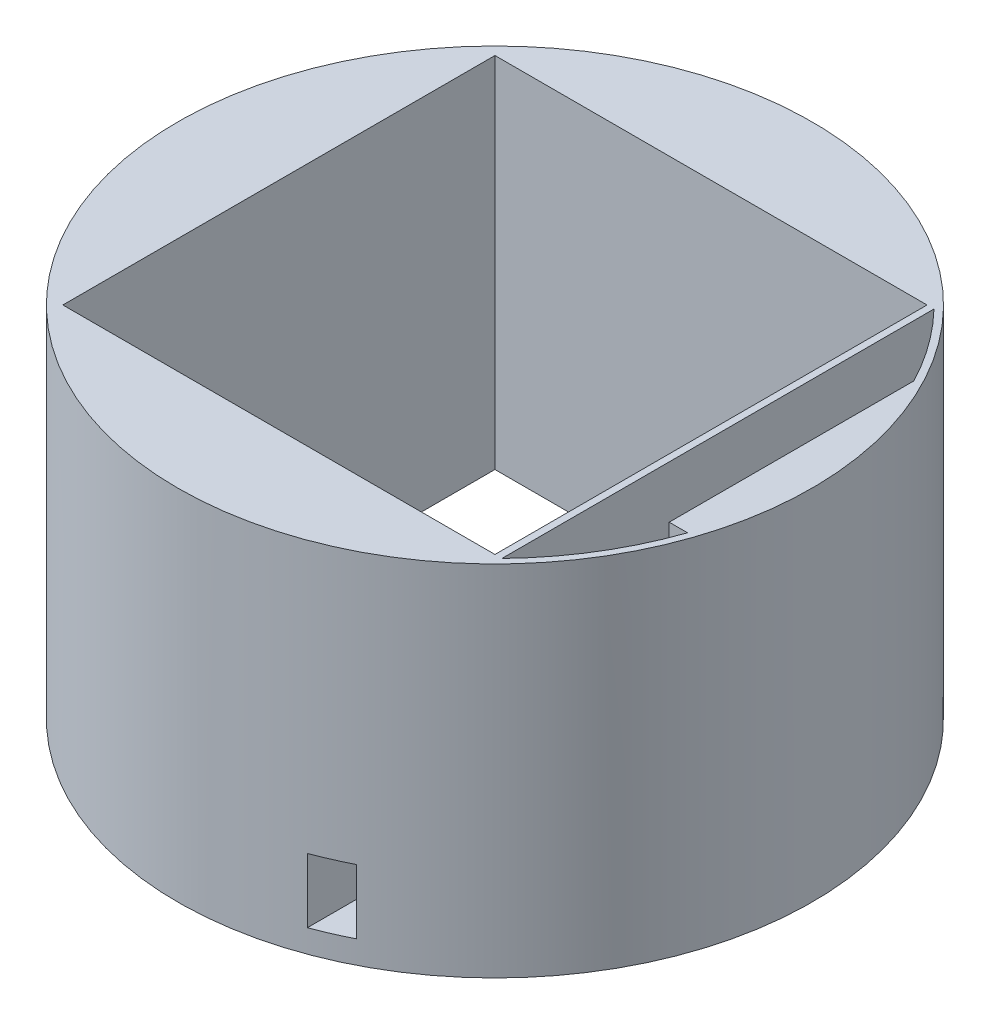
ISO-10303-21;
HEADER;
FILE_DESCRIPTION(('STEP AP214'),'2;1');
FILE_NAME('part.step','',(''),(''),'','','');
FILE_SCHEMA(('AUTOMOTIVE_DESIGN { 1 0 10303 214 1 1 1 1 }'));
ENDSEC;
DATA;
#1=APPLICATION_CONTEXT('core data for automotive mechanical design processes');
#2=APPLICATION_PROTOCOL_DEFINITION('international standard','automotive_design',2000,#1);
#3=PRODUCT_CONTEXT('',#1,'mechanical');
#4=PRODUCT('Part','Part','',(#3));
#5=PRODUCT_RELATED_PRODUCT_CATEGORY('part','',(#4));
#6=PRODUCT_DEFINITION_FORMATION('','',#4);
#7=PRODUCT_DEFINITION_CONTEXT('part definition',#1,'design');
#8=PRODUCT_DEFINITION('design','',#6,#7);
#9=PRODUCT_DEFINITION_SHAPE('','',#8);
#10=(LENGTH_UNIT() NAMED_UNIT(*) SI_UNIT(.MILLI.,.METRE.));
#11=(NAMED_UNIT(*) PLANE_ANGLE_UNIT() SI_UNIT($,.RADIAN.));
#12=(NAMED_UNIT(*) SI_UNIT($,.STERADIAN.) SOLID_ANGLE_UNIT());
#13=UNCERTAINTY_MEASURE_WITH_UNIT(LENGTH_MEASURE(1.E-05),#10,'distance_accuracy_value','');
#14=(GEOMETRIC_REPRESENTATION_CONTEXT(3) GLOBAL_UNCERTAINTY_ASSIGNED_CONTEXT((#13)) GLOBAL_UNIT_ASSIGNED_CONTEXT((#10,
#11,#12)) REPRESENTATION_CONTEXT('',''));
#15=CARTESIAN_POINT('',(0.,0.,0.));
#16=DIRECTION('',(0.,0.,1.));
#17=DIRECTION('',(1.,0.,0.));
#18=AXIS2_PLACEMENT_3D('',#15,#16,#17);
#19=CARTESIAN_POINT('',(0.,2.5,0.));
#20=DIRECTION('',(0.,-1.,0.));
#21=DIRECTION('',(0.,0.,-1.));
#22=AXIS2_PLACEMENT_3D('',#19,#20,#21);
#23=CYLINDRICAL_SURFACE('',#22,33.7713769837538);
#24=CARTESIAN_POINT('',(0.,0.,0.));
#25=DIRECTION('',(0.,1.,0.));
#26=DIRECTION('',(0.,0.,1.));
#27=AXIS2_PLACEMENT_3D('',#24,#25,#26);
#28=CIRCLE('',#27,33.7713769837538);
#29=CARTESIAN_POINT('',(24.2539873707153,0.,23.5));
#30=VERTEX_POINT('',#29);
#31=CARTESIAN_POINT('',(31.9353808803689,0.,10.9835036033403));
#32=VERTEX_POINT('',#31);
#33=EDGE_CURVE('E356',#30,#32,#28,.T.);
#34=ORIENTED_EDGE('',*,*,#33,.F.);
#35=DIRECTION('',(0.,-1.,0.));
#36=VECTOR('',#35,1.);
#37=CARTESIAN_POINT('',(24.2539873707153,2.5,23.5));
#38=LINE('',#37,#36);
#39=CARTESIAN_POINT('',(24.2539873707153,7.,23.5));
#40=VERTEX_POINT('',#39);
#41=EDGE_CURVE('E80',#40,#30,#38,.T.);
#42=ORIENTED_EDGE('',*,*,#41,.F.);
#43=DIRECTION('',(0.,-1.,0.));
#44=VECTOR('',#43,1.);
#45=CARTESIAN_POINT('',(24.2539873707153,9.5,23.5));
#46=LINE('',#45,#44);
#47=CARTESIAN_POINT('',(24.2539873707153,39.,23.5));
#48=VERTEX_POINT('',#47);
#49=EDGE_CURVE('E308',#48,#40,#46,.T.);
#50=ORIENTED_EDGE('',*,*,#49,.F.);
#51=CARTESIAN_POINT('',(0.,39.,0.));
#52=DIRECTION('',(0.,1.,0.));
#53=DIRECTION('',(0.,0.,1.));
#54=AXIS2_PLACEMENT_3D('',#51,#52,#53);
#55=CIRCLE('',#54,33.7713769837538);
#56=CARTESIAN_POINT('',(31.9353808803689,39.,10.9835036033403));
#57=VERTEX_POINT('',#56);
#58=EDGE_CURVE('E237',#57,#48,#55,.F.);
#59=ORIENTED_EDGE('',*,*,#58,.F.);
#60=DIRECTION('',(0.,-1.,0.));
#61=VECTOR('',#60,1.);
#62=CARTESIAN_POINT('',(31.9353808803689,2.5,10.9835036033403));
#63=LINE('',#62,#61);
#64=EDGE_CURVE('E364',#57,#32,#63,.T.);
#65=ORIENTED_EDGE('',*,*,#64,.T.);
#66=EDGE_LOOP('',(#34,#42,#50,#59,#65));
#67=FACE_BOUND('',#66,.T.);
#68=ADVANCED_FACE('F77',(#67),#23,.F.);
#69=CARTESIAN_POINT('',(0.,2.5,23.5));
#70=DIRECTION('',(0.,0.,-1.));
#71=DIRECTION('',(-1.,0.,0.));
#72=AXIS2_PLACEMENT_3D('',#69,#70,#71);
#73=PLANE('',#72);
#74=DIRECTION('',(0.,-1.,0.));
#75=VECTOR('',#74,1.);
#76=CARTESIAN_POINT('',(15.6883602187177,7.,23.5));
#77=LINE('',#76,#75);
#78=CARTESIAN_POINT('',(15.6883602187177,9.5,23.5));
#79=VERTEX_POINT('',#78);
#80=CARTESIAN_POINT('',(15.6883602187177,2.5,23.5));
#81=VERTEX_POINT('',#80);
#82=EDGE_CURVE('E352',#79,#81,#77,.T.);
#83=ORIENTED_EDGE('',*,*,#82,.F.);
#84=DIRECTION('',(-1.,0.,0.));
#85=VECTOR('',#84,1.);
#86=CARTESIAN_POINT('',(0.,9.5,23.5));
#87=LINE('',#86,#85);
#88=CARTESIAN_POINT('',(11.9573026246151,9.5,23.5));
#89=VERTEX_POINT('',#88);
#90=EDGE_CURVE('E270',#79,#89,#87,.T.);
#91=ORIENTED_EDGE('',*,*,#90,.T.);
#92=DIRECTION('',(0.,-1.,0.));
#93=VECTOR('',#92,1.);
#94=CARTESIAN_POINT('',(11.9573026246151,7.,23.5));
#95=LINE('',#94,#93);
#96=CARTESIAN_POINT('',(11.9573026246151,2.5,23.5));
#97=VERTEX_POINT('',#96);
#98=EDGE_CURVE('E331',#89,#97,#95,.T.);
#99=ORIENTED_EDGE('',*,*,#98,.T.);
#100=DIRECTION('',(1.,0.,0.));
#101=VECTOR('',#100,1.);
#102=CARTESIAN_POINT('',(0.,2.5,23.5));
#103=LINE('',#102,#101);
#104=EDGE_CURVE('E357',#97,#81,#103,.T.);
#105=ORIENTED_EDGE('',*,*,#104,.T.);
#106=EDGE_LOOP('',(#83,#91,#99,#105));
#107=FACE_BOUND('',#106,.T.);
#108=DIRECTION('',(1.,0.,0.));
#109=VECTOR('',#108,1.);
#110=CARTESIAN_POINT('',(0.,0.,23.5));
#111=LINE('',#110,#109);
#112=CARTESIAN_POINT('',(-25.2586618806302,0.,23.5));
#113=VERTEX_POINT('',#112);
#114=EDGE_CURVE('E368',#113,#30,#111,.T.);
#115=ORIENTED_EDGE('',*,*,#114,.F.);
#116=DIRECTION('',(0.,-1.,0.));
#117=VECTOR('',#116,1.);
#118=CARTESIAN_POINT('',(-25.2586618806302,2.5,23.5));
#119=LINE('',#118,#117);
#120=CARTESIAN_POINT('',(-25.2586618806302,7.,23.5));
#121=VERTEX_POINT('',#120);
#122=EDGE_CURVE('E411',#121,#113,#119,.T.);
#123=ORIENTED_EDGE('',*,*,#122,.F.);
#124=DIRECTION('',(-1.,0.,0.));
#125=VECTOR('',#124,1.);
#126=CARTESIAN_POINT('',(0.,7.,23.5));
#127=LINE('',#126,#125);
#128=CARTESIAN_POINT('',(-23.5,7.,23.5));
#129=VERTEX_POINT('',#128);
#130=EDGE_CURVE('E320',#129,#121,#127,.T.);
#131=ORIENTED_EDGE('',*,*,#130,.F.);
#132=DIRECTION('',(0.,-1.,0.));
#133=VECTOR('',#132,1.);
#134=CARTESIAN_POINT('',(-23.5,9.5,23.5));
#135=LINE('',#134,#133);
#136=CARTESIAN_POINT('',(-23.5,39.,23.5));
#137=VERTEX_POINT('',#136);
#138=EDGE_CURVE('E291',#137,#129,#135,.T.);
#139=ORIENTED_EDGE('',*,*,#138,.F.);
#140=DIRECTION('',(-1.,0.,0.));
#141=VECTOR('',#140,1.);
#142=CARTESIAN_POINT('',(0.,39.,23.5));
#143=LINE('',#142,#141);
#144=CARTESIAN_POINT('',(23.5,39.,23.5));
#145=VERTEX_POINT('',#144);
#146=EDGE_CURVE('E253',#145,#137,#143,.T.);
#147=ORIENTED_EDGE('',*,*,#146,.F.);
#148=DIRECTION('',(0.,-1.,0.));
#149=VECTOR('',#148,1.);
#150=CARTESIAN_POINT('',(23.5,9.5,23.5));
#151=LINE('',#150,#149);
#152=CARTESIAN_POINT('',(23.5,7.,23.5));
#153=VERTEX_POINT('',#152);
#154=EDGE_CURVE('E309',#145,#153,#151,.T.);
#155=ORIENTED_EDGE('',*,*,#154,.T.);
#156=DIRECTION('',(-1.,0.,0.));
#157=VECTOR('',#156,1.);
#158=CARTESIAN_POINT('',(0.,7.,23.5));
#159=LINE('',#158,#157);
#160=EDGE_CURVE('E336',#40,#153,#159,.T.);
#161=ORIENTED_EDGE('',*,*,#160,.F.);
#162=ORIENTED_EDGE('',*,*,#41,.T.);
#163=EDGE_LOOP('',(#115,#123,#131,#139,#147,#155,#161,#162));
#164=FACE_BOUND('',#163,.T.);
#165=ADVANCED_FACE('F420',(#107,#164),#73,.T.);
#166=CARTESIAN_POINT('',(0.,2.5,0.));
#167=DIRECTION('',(0.,-1.,0.));
#168=DIRECTION('',(0.,0.,-1.));
#169=AXIS2_PLACEMENT_3D('',#166,#167,#168);
#170=CYLINDRICAL_SURFACE('',#169,34.5);
#171=DIRECTION('',(0.,-1.,0.));
#172=VECTOR('',#171,1.);
#173=CARTESIAN_POINT('',(-32.7049330926607,2.5,10.9835036033403));
#174=LINE('',#173,#172);
#175=CARTESIAN_POINT('',(-32.7049330926607,7.,10.9835036033403));
#176=VERTEX_POINT('',#175);
#177=CARTESIAN_POINT('',(-32.7049330926607,0.,10.9835036033403));
#178=VERTEX_POINT('',#177);
#179=EDGE_CURVE('E409',#176,#178,#174,.T.);
#180=ORIENTED_EDGE('',*,*,#179,.F.);
#181=CARTESIAN_POINT('',(0.,7.,0.));
#182=DIRECTION('',(0.,1.,0.));
#183=DIRECTION('',(0.,0.,1.));
#184=AXIS2_PLACEMENT_3D('',#181,#182,#183);
#185=CIRCLE('',#184,34.5);
#186=EDGE_CURVE('E295',#176,#121,#185,.T.);
#187=ORIENTED_EDGE('',*,*,#186,.T.);
#188=ORIENTED_EDGE('',*,*,#122,.T.);
#189=CARTESIAN_POINT('',(0.,0.,0.));
#190=DIRECTION('',(0.,1.,0.));
#191=DIRECTION('',(0.,0.,1.));
#192=AXIS2_PLACEMENT_3D('',#189,#190,#191);
#193=CIRCLE('',#192,34.5);
#194=EDGE_CURVE('E372',#113,#178,#193,.T.);
#195=ORIENTED_EDGE('',*,*,#194,.T.);
#196=EDGE_LOOP('',(#180,#187,#188,#195));
#197=FACE_BOUND('',#196,.T.);
#198=DIRECTION('',(0.,-1.,0.));
#199=VECTOR('',#198,1.);
#200=CARTESIAN_POINT('',(11.9573026246151,7.,32.3615962823742));
#201=LINE('',#200,#199);
#202=CARTESIAN_POINT('',(11.9573026246151,9.5,32.3615962823742));
#203=VERTEX_POINT('',#202);
#204=CARTESIAN_POINT('',(11.9573026246151,2.5,32.3615962823742));
#205=VERTEX_POINT('',#204);
#206=EDGE_CURVE('E324',#203,#205,#201,.T.);
#207=ORIENTED_EDGE('',*,*,#206,.F.);
#208=CARTESIAN_POINT('',(0.,9.5,0.));
#209=DIRECTION('',(0.,1.,0.));
#210=DIRECTION('',(0.,0.,1.));
#211=AXIS2_PLACEMENT_3D('',#208,#209,#210);
#212=CIRCLE('',#211,34.5);
#213=CARTESIAN_POINT('',(15.6883602187177,9.5,30.7266228806186));
#214=VERTEX_POINT('',#213);
#215=EDGE_CURVE('E262',#203,#214,#212,.T.);
#216=ORIENTED_EDGE('',*,*,#215,.T.);
#217=DIRECTION('',(0.,-1.,0.));
#218=VECTOR('',#217,1.);
#219=CARTESIAN_POINT('',(15.6883602187177,7.,30.7266228806186));
#220=LINE('',#219,#218);
#221=CARTESIAN_POINT('',(15.6883602187177,2.5,30.7266228806186));
#222=VERTEX_POINT('',#221);
#223=EDGE_CURVE('E345',#214,#222,#220,.T.);
#224=ORIENTED_EDGE('',*,*,#223,.T.);
#225=CARTESIAN_POINT('',(0.,2.5,0.));
#226=DIRECTION('',(0.,1.,0.));
#227=DIRECTION('',(0.,0.,1.));
#228=AXIS2_PLACEMENT_3D('',#225,#226,#227);
#229=CIRCLE('',#228,34.5);
#230=EDGE_CURVE('E360',#205,#222,#229,.T.);
#231=ORIENTED_EDGE('',*,*,#230,.F.);
#232=EDGE_LOOP('',(#207,#216,#224,#231));
#233=FACE_BOUND('',#232,.T.);
#234=CARTESIAN_POINT('',(0.,39.,0.));
#235=DIRECTION('',(0.,1.,0.));
#236=DIRECTION('',(0.,0.,1.));
#237=AXIS2_PLACEMENT_3D('',#234,#235,#236);
#238=CIRCLE('',#237,34.5);
#239=CARTESIAN_POINT('',(0.,39.,34.5));
#240=VERTEX_POINT('',#239);
#241=EDGE_CURVE('E229',#240,#240,#238,.T.);
#242=ORIENTED_EDGE('',*,*,#241,.F.);
#243=EDGE_LOOP('',(#242));
#244=FACE_BOUND('',#243,.T.);
#245=ADVANCED_FACE('F428',(#197,#233,#244),#170,.T.);
#246=CARTESIAN_POINT('',(0.,2.5,10.9835036033403));
#247=DIRECTION('',(0.,0.,1.));
#248=DIRECTION('',(1.,0.,0.));
#249=AXIS2_PLACEMENT_3D('',#246,#247,#248);
#250=PLANE('',#249);
#251=DIRECTION('',(-1.,0.,0.));
#252=VECTOR('',#251,1.);
#253=CARTESIAN_POINT('',(0.,0.,10.9835036033403));
#254=LINE('',#253,#252);
#255=CARTESIAN_POINT('',(-23.5,0.,10.9835036033403));
#256=VERTEX_POINT('',#255);
#257=EDGE_CURVE('E376',#256,#178,#254,.T.);
#258=ORIENTED_EDGE('',*,*,#257,.F.);
#259=DIRECTION('',(0.,-1.,0.));
#260=VECTOR('',#259,1.);
#261=CARTESIAN_POINT('',(-23.5,2.5,10.9835036033403));
#262=LINE('',#261,#260);
#263=CARTESIAN_POINT('',(-23.5,7.,10.9835036033403));
#264=VERTEX_POINT('',#263);
#265=EDGE_CURVE('E406',#264,#256,#262,.T.);
#266=ORIENTED_EDGE('',*,*,#265,.F.);
#267=DIRECTION('',(1.,0.,0.));
#268=VECTOR('',#267,1.);
#269=CARTESIAN_POINT('',(0.,7.,10.9835036033403));
#270=LINE('',#269,#268);
#271=EDGE_CURVE('E339',#176,#264,#270,.T.);
#272=ORIENTED_EDGE('',*,*,#271,.F.);
#273=ORIENTED_EDGE('',*,*,#179,.T.);
#274=EDGE_LOOP('',(#258,#266,#272,#273));
#275=FACE_BOUND('',#274,.T.);
#276=ADVANCED_FACE('F433',(#275),#250,.T.);
#277=CARTESIAN_POINT('',(-23.5,2.5,0.));
#278=DIRECTION('',(-1.,0.,0.));
#279=DIRECTION('',(0.,0.,1.));
#280=AXIS2_PLACEMENT_3D('',#277,#278,#279);
#281=PLANE('',#280);
#282=DIRECTION('',(0.,0.,-1.));
#283=VECTOR('',#282,1.);
#284=CARTESIAN_POINT('',(-23.5,0.,0.));
#285=LINE('',#284,#283);
#286=CARTESIAN_POINT('',(-23.5,0.,-23.5));
#287=VERTEX_POINT('',#286);
#288=EDGE_CURVE('E380',#256,#287,#285,.T.);
#289=ORIENTED_EDGE('',*,*,#288,.T.);
#290=DIRECTION('',(0.,-1.,0.));
#291=VECTOR('',#290,1.);
#292=CARTESIAN_POINT('',(-23.5,2.5,-23.5));
#293=LINE('',#292,#291);
#294=CARTESIAN_POINT('',(-23.5,39.,-23.5));
#295=VERTEX_POINT('',#294);
#296=EDGE_CURVE('E402',#295,#287,#293,.T.);
#297=ORIENTED_EDGE('',*,*,#296,.F.);
#298=DIRECTION('',(0.,0.,-1.));
#299=VECTOR('',#298,1.);
#300=CARTESIAN_POINT('',(-23.5,39.,0.));
#301=LINE('',#300,#299);
#302=EDGE_CURVE('E257',#137,#295,#301,.T.);
#303=ORIENTED_EDGE('',*,*,#302,.F.);
#304=ORIENTED_EDGE('',*,*,#138,.T.);
#305=DIRECTION('',(0.,0.,-1.));
#306=VECTOR('',#305,1.);
#307=CARTESIAN_POINT('',(-23.5,7.,0.));
#308=LINE('',#307,#306);
#309=EDGE_CURVE('E299',#129,#264,#308,.T.);
#310=ORIENTED_EDGE('',*,*,#309,.T.);
#311=ORIENTED_EDGE('',*,*,#265,.T.);
#312=EDGE_LOOP('',(#289,#297,#303,#304,#310,#311));
#313=FACE_BOUND('',#312,.T.);
#314=ADVANCED_FACE('F440',(#313),#281,.F.);
#315=CARTESIAN_POINT('',(0.,2.5,-23.5));
#316=DIRECTION('',(0.,0.,-1.));
#317=DIRECTION('',(-1.,0.,0.));
#318=AXIS2_PLACEMENT_3D('',#315,#316,#317);
#319=PLANE('',#318);
#320=DIRECTION('',(1.,0.,0.));
#321=VECTOR('',#320,1.);
#322=CARTESIAN_POINT('',(0.,0.,-23.5));
#323=LINE('',#322,#321);
#324=CARTESIAN_POINT('',(23.5,0.,-23.5));
#325=VERTEX_POINT('',#324);
#326=EDGE_CURVE('E383',#287,#325,#323,.T.);
#327=ORIENTED_EDGE('',*,*,#326,.T.);
#328=DIRECTION('',(0.,-1.,0.));
#329=VECTOR('',#328,1.);
#330=CARTESIAN_POINT('',(23.5,2.5,-23.5));
#331=LINE('',#330,#329);
#332=CARTESIAN_POINT('',(23.5,39.,-23.5));
#333=VERTEX_POINT('',#332);
#334=EDGE_CURVE('E399',#333,#325,#331,.T.);
#335=ORIENTED_EDGE('',*,*,#334,.F.);
#336=DIRECTION('',(1.,0.,0.));
#337=VECTOR('',#336,1.);
#338=CARTESIAN_POINT('',(0.,39.,-23.5));
#339=LINE('',#338,#337);
#340=EDGE_CURVE('E245',#295,#333,#339,.T.);
#341=ORIENTED_EDGE('',*,*,#340,.F.);
#342=ORIENTED_EDGE('',*,*,#296,.T.);
#343=EDGE_LOOP('',(#327,#335,#341,#342));
#344=FACE_BOUND('',#343,.T.);
#345=ADVANCED_FACE('F443',(#344),#319,.F.);
#346=CARTESIAN_POINT('',(23.5,2.5,0.));
#347=DIRECTION('',(-1.,0.,0.));
#348=DIRECTION('',(0.,0.,1.));
#349=AXIS2_PLACEMENT_3D('',#346,#347,#348);
#350=PLANE('',#349);
#351=DIRECTION('',(0.,0.,-1.));
#352=VECTOR('',#351,1.);
#353=CARTESIAN_POINT('',(23.5,0.,0.));
#354=LINE('',#353,#352);
#355=CARTESIAN_POINT('',(23.5,0.,10.9835036033403));
#356=VERTEX_POINT('',#355);
#357=EDGE_CURVE('E387',#356,#325,#354,.T.);
#358=ORIENTED_EDGE('',*,*,#357,.F.);
#359=DIRECTION('',(0.,-1.,0.));
#360=VECTOR('',#359,1.);
#361=CARTESIAN_POINT('',(23.5,2.5,10.9835036033403));
#362=LINE('',#361,#360);
#363=CARTESIAN_POINT('',(23.5,7.,10.9835036033403));
#364=VERTEX_POINT('',#363);
#365=EDGE_CURVE('E396',#364,#356,#362,.T.);
#366=ORIENTED_EDGE('',*,*,#365,.F.);
#367=DIRECTION('',(0.,0.,1.));
#368=VECTOR('',#367,1.);
#369=CARTESIAN_POINT('',(23.5,7.,0.));
#370=LINE('',#369,#368);
#371=EDGE_CURVE('E215',#364,#153,#370,.T.);
#372=ORIENTED_EDGE('',*,*,#371,.T.);
#373=ORIENTED_EDGE('',*,*,#154,.F.);
#374=DIRECTION('',(0.,0.,1.));
#375=VECTOR('',#374,1.);
#376=CARTESIAN_POINT('',(23.5,39.,0.));
#377=LINE('',#376,#375);
#378=EDGE_CURVE('E249',#333,#145,#377,.T.);
#379=ORIENTED_EDGE('',*,*,#378,.F.);
#380=ORIENTED_EDGE('',*,*,#334,.T.);
#381=EDGE_LOOP('',(#358,#366,#372,#373,#379,#380));
#382=FACE_BOUND('',#381,.T.);
#383=ADVANCED_FACE('F448',(#382),#350,.T.);
#384=CARTESIAN_POINT('',(0.,2.5,10.9835036033403));
#385=DIRECTION('',(0.,0.,-1.));
#386=DIRECTION('',(-1.,0.,0.));
#387=AXIS2_PLACEMENT_3D('',#384,#385,#386);
#388=PLANE('',#387);
#389=DIRECTION('',(1.,0.,0.));
#390=VECTOR('',#389,1.);
#391=CARTESIAN_POINT('',(0.,0.,10.9835036033403));
#392=LINE('',#391,#390);
#393=EDGE_CURVE('E361',#356,#32,#392,.T.);
#394=ORIENTED_EDGE('',*,*,#393,.T.);
#395=ORIENTED_EDGE('',*,*,#64,.F.);
#396=DIRECTION('',(1.,0.,0.));
#397=VECTOR('',#396,1.);
#398=CARTESIAN_POINT('',(0.,39.,10.9835036033403));
#399=LINE('',#398,#397);
#400=CARTESIAN_POINT('',(29.9353808803689,39.,10.9835036033403));
#401=VERTEX_POINT('',#400);
#402=EDGE_CURVE('E234',#401,#57,#399,.T.);
#403=ORIENTED_EDGE('',*,*,#402,.F.);
#404=DIRECTION('',(0.,-1.,0.));
#405=VECTOR('',#404,1.);
#406=CARTESIAN_POINT('',(29.9353808803689,39.,10.9835036033403));
#407=LINE('',#406,#405);
#408=CARTESIAN_POINT('',(29.9353808803689,9.5,10.9835036033403));
#409=VERTEX_POINT('',#408);
#410=EDGE_CURVE('E216',#401,#409,#407,.T.);
#411=ORIENTED_EDGE('',*,*,#410,.T.);
#412=DIRECTION('',(1.,0.,0.));
#413=VECTOR('',#412,1.);
#414=CARTESIAN_POINT('',(0.,9.5,10.9835036033403));
#415=LINE('',#414,#413);
#416=CARTESIAN_POINT('',(24.2539873707153,9.5,10.9835036033403));
#417=VERTEX_POINT('',#416);
#418=EDGE_CURVE('E287',#417,#409,#415,.T.);
#419=ORIENTED_EDGE('',*,*,#418,.F.);
#420=DIRECTION('',(0.,-1.,0.));
#421=VECTOR('',#420,1.);
#422=CARTESIAN_POINT('',(24.2539873707153,9.5,10.9835036033403));
#423=LINE('',#422,#421);
#424=CARTESIAN_POINT('',(24.2539873707153,7.,10.9835036033403));
#425=VERTEX_POINT('',#424);
#426=EDGE_CURVE('E305',#417,#425,#423,.T.);
#427=ORIENTED_EDGE('',*,*,#426,.T.);
#428=DIRECTION('',(1.,0.,0.));
#429=VECTOR('',#428,1.);
#430=CARTESIAN_POINT('',(0.,7.,10.9835036033403));
#431=LINE('',#430,#429);
#432=EDGE_CURVE('E101',#364,#425,#431,.T.);
#433=ORIENTED_EDGE('',*,*,#432,.F.);
#434=ORIENTED_EDGE('',*,*,#365,.T.);
#435=EDGE_LOOP('',(#394,#395,#403,#411,#419,#427,#433,#434));
#436=FACE_BOUND('',#435,.T.);
#437=ADVANCED_FACE('F456',(#436),#388,.F.);
#438=CARTESIAN_POINT('',(0.,2.5,0.));
#439=DIRECTION('',(0.,1.,0.));
#440=DIRECTION('',(0.,0.,1.));
#441=AXIS2_PLACEMENT_3D('',#438,#439,#440);
#442=PLANE('',#441);
#443=DIRECTION('',(0.,0.,1.));
#444=VECTOR('',#443,1.);
#445=CARTESIAN_POINT('',(11.9573026246151,2.5,0.));
#446=LINE('',#445,#444);
#447=EDGE_CURVE('E313',#97,#205,#446,.T.);
#448=ORIENTED_EDGE('',*,*,#447,.T.);
#449=ORIENTED_EDGE('',*,*,#230,.T.);
#450=DIRECTION('',(0.,0.,1.));
#451=VECTOR('',#450,1.);
#452=CARTESIAN_POINT('',(15.6883602187177,2.5,0.));
#453=LINE('',#452,#451);
#454=EDGE_CURVE('E335',#81,#222,#453,.T.);
#455=ORIENTED_EDGE('',*,*,#454,.F.);
#456=ORIENTED_EDGE('',*,*,#104,.F.);
#457=EDGE_LOOP('',(#448,#449,#455,#456));
#458=FACE_BOUND('',#457,.T.);
#459=ADVANCED_FACE('F490',(#458),#442,.T.);
#460=CARTESIAN_POINT('',(0.,0.,0.));
#461=DIRECTION('',(0.,1.,0.));
#462=DIRECTION('',(0.,0.,1.));
#463=AXIS2_PLACEMENT_3D('',#460,#461,#462);
#464=PLANE('',#463);
#465=ORIENTED_EDGE('',*,*,#33,.T.);
#466=ORIENTED_EDGE('',*,*,#393,.F.);
#467=ORIENTED_EDGE('',*,*,#357,.T.);
#468=ORIENTED_EDGE('',*,*,#326,.F.);
#469=ORIENTED_EDGE('',*,*,#288,.F.);
#470=ORIENTED_EDGE('',*,*,#257,.T.);
#471=ORIENTED_EDGE('',*,*,#194,.F.);
#472=ORIENTED_EDGE('',*,*,#114,.T.);
#473=EDGE_LOOP('',(#465,#466,#467,#468,#469,#470,#471,#472));
#474=FACE_BOUND('',#473,.T.);
#475=ADVANCED_FACE('F425',(#474),#464,.F.);
#476=CARTESIAN_POINT('',(15.6883602187177,7.,0.));
#477=DIRECTION('',(1.,0.,0.));
#478=DIRECTION('',(0.,0.,-1.));
#479=AXIS2_PLACEMENT_3D('',#476,#477,#478);
#480=PLANE('',#479);
#481=ORIENTED_EDGE('',*,*,#454,.T.);
#482=ORIENTED_EDGE('',*,*,#223,.F.);
#483=DIRECTION('',(0.,0.,1.));
#484=VECTOR('',#483,1.);
#485=CARTESIAN_POINT('',(15.6883602187177,9.5,0.));
#486=LINE('',#485,#484);
#487=EDGE_CURVE('E279',#79,#214,#486,.T.);
#488=ORIENTED_EDGE('',*,*,#487,.F.);
#489=ORIENTED_EDGE('',*,*,#82,.T.);
#490=EDGE_LOOP('',(#481,#482,#488,#489));
#491=FACE_BOUND('',#490,.T.);
#492=ADVANCED_FACE('F493',(#491),#480,.F.);
#493=CARTESIAN_POINT('',(11.9573026246151,7.,0.));
#494=DIRECTION('',(1.,0.,0.));
#495=DIRECTION('',(0.,0.,-1.));
#496=AXIS2_PLACEMENT_3D('',#493,#494,#495);
#497=PLANE('',#496);
#498=ORIENTED_EDGE('',*,*,#447,.F.);
#499=ORIENTED_EDGE('',*,*,#98,.F.);
#500=DIRECTION('',(0.,0.,1.));
#501=VECTOR('',#500,1.);
#502=CARTESIAN_POINT('',(11.9573026246151,9.5,0.));
#503=LINE('',#502,#501);
#504=EDGE_CURVE('E282',#89,#203,#503,.T.);
#505=ORIENTED_EDGE('',*,*,#504,.T.);
#506=ORIENTED_EDGE('',*,*,#206,.T.);
#507=EDGE_LOOP('',(#498,#499,#505,#506));
#508=FACE_BOUND('',#507,.T.);
#509=ADVANCED_FACE('F499',(#508),#497,.T.);
#510=CARTESIAN_POINT('',(0.,7.,0.));
#511=DIRECTION('',(0.,1.,0.));
#512=DIRECTION('',(0.,0.,1.));
#513=AXIS2_PLACEMENT_3D('',#510,#511,#512);
#514=PLANE('',#513);
#515=ORIENTED_EDGE('',*,*,#160,.T.);
#516=ORIENTED_EDGE('',*,*,#371,.F.);
#517=ORIENTED_EDGE('',*,*,#432,.T.);
#518=DIRECTION('',(0.,0.,1.));
#519=VECTOR('',#518,1.);
#520=CARTESIAN_POINT('',(24.2539873707153,7.,0.));
#521=LINE('',#520,#519);
#522=EDGE_CURVE('E283',#425,#40,#521,.T.);
#523=ORIENTED_EDGE('',*,*,#522,.T.);
#524=EDGE_LOOP('',(#515,#516,#517,#523));
#525=FACE_BOUND('',#524,.T.);
#526=ADVANCED_FACE('F449',(#525),#514,.F.);
#527=CARTESIAN_POINT('',(24.2539873707153,9.5,0.));
#528=DIRECTION('',(1.,0.,0.));
#529=DIRECTION('',(0.,0.,-1.));
#530=AXIS2_PLACEMENT_3D('',#527,#528,#529);
#531=PLANE('',#530);
#532=ORIENTED_EDGE('',*,*,#522,.F.);
#533=ORIENTED_EDGE('',*,*,#426,.F.);
#534=DIRECTION('',(0.,0.,-1.));
#535=VECTOR('',#534,1.);
#536=CARTESIAN_POINT('',(24.2539873707153,9.5,0.));
#537=LINE('',#536,#535);
#538=CARTESIAN_POINT('',(24.2539873707153,9.5,-23.5));
#539=VERTEX_POINT('',#538);
#540=EDGE_CURVE('E12',#417,#539,#537,.T.);
#541=ORIENTED_EDGE('',*,*,#540,.T.);
#542=DIRECTION('',(0.,-1.,0.));
#543=VECTOR('',#542,1.);
#544=CARTESIAN_POINT('',(24.2539873707153,39.,-23.5));
#545=LINE('',#544,#543);
#546=CARTESIAN_POINT('',(24.2539873707153,39.,-23.5));
#547=VERTEX_POINT('',#546);
#548=EDGE_CURVE('E261',#547,#539,#545,.T.);
#549=ORIENTED_EDGE('',*,*,#548,.F.);
#550=DIRECTION('',(0.,0.,-1.));
#551=VECTOR('',#550,1.);
#552=CARTESIAN_POINT('',(24.2539873707153,39.,0.));
#553=LINE('',#552,#551);
#554=EDGE_CURVE('E226',#48,#547,#553,.T.);
#555=ORIENTED_EDGE('',*,*,#554,.F.);
#556=ORIENTED_EDGE('',*,*,#49,.T.);
#557=EDGE_LOOP('',(#532,#533,#541,#549,#555,#556));
#558=FACE_BOUND('',#557,.T.);
#559=ADVANCED_FACE('F453',(#558),#531,.T.);
#560=CARTESIAN_POINT('',(0.,9.5,0.));
#561=DIRECTION('',(0.,1.,0.));
#562=DIRECTION('',(0.,0.,1.));
#563=AXIS2_PLACEMENT_3D('',#560,#561,#562);
#564=PLANE('',#563);
#565=ORIENTED_EDGE('',*,*,#540,.F.);
#566=ORIENTED_EDGE('',*,*,#418,.T.);
#567=DIRECTION('',(0.,0.,-1.));
#568=VECTOR('',#567,1.);
#569=CARTESIAN_POINT('',(29.9353808803689,9.5,0.));
#570=LINE('',#569,#568);
#571=CARTESIAN_POINT('',(29.9353808803689,9.5,-15.6326221385302));
#572=VERTEX_POINT('',#571);
#573=EDGE_CURVE('E268',#409,#572,#570,.T.);
#574=ORIENTED_EDGE('',*,*,#573,.T.);
#575=CARTESIAN_POINT('',(0.,9.5,0.));
#576=DIRECTION('',(0.,1.,0.));
#577=DIRECTION('',(0.,0.,1.));
#578=AXIS2_PLACEMENT_3D('',#575,#576,#577);
#579=CIRCLE('',#578,33.7713769837538);
#580=EDGE_CURVE('E93',#572,#539,#579,.T.);
#581=ORIENTED_EDGE('',*,*,#580,.T.);
#582=EDGE_LOOP('',(#565,#566,#574,#581));
#583=FACE_BOUND('',#582,.T.);
#584=ADVANCED_FACE('F458',(#583),#564,.T.);
#585=ORIENTED_EDGE('',*,*,#130,.T.);
#586=ORIENTED_EDGE('',*,*,#186,.F.);
#587=ORIENTED_EDGE('',*,*,#271,.T.);
#588=ORIENTED_EDGE('',*,*,#309,.F.);
#589=EDGE_LOOP('',(#585,#586,#587,#588));
#590=FACE_BOUND('',#589,.T.);
#591=ADVANCED_FACE('F436',(#590),#514,.F.);
#592=CARTESIAN_POINT('',(0.,9.5,0.));
#593=DIRECTION('',(0.,1.,0.));
#594=DIRECTION('',(0.,0.,1.));
#595=AXIS2_PLACEMENT_3D('',#592,#593,#594);
#596=PLANE('',#595);
#597=ORIENTED_EDGE('',*,*,#90,.F.);
#598=ORIENTED_EDGE('',*,*,#487,.T.);
#599=ORIENTED_EDGE('',*,*,#215,.F.);
#600=ORIENTED_EDGE('',*,*,#504,.F.);
#601=EDGE_LOOP('',(#597,#598,#599,#600));
#602=FACE_BOUND('',#601,.T.);
#603=ADVANCED_FACE('F465',(#602),#596,.F.);
#604=CARTESIAN_POINT('',(0.,39.,0.));
#605=DIRECTION('',(0.,-1.,0.));
#606=DIRECTION('',(0.,0.,-1.));
#607=AXIS2_PLACEMENT_3D('',#604,#605,#606);
#608=CYLINDRICAL_SURFACE('',#607,33.7713769837538);
#609=ORIENTED_EDGE('',*,*,#580,.F.);
#610=DIRECTION('',(0.,-1.,0.));
#611=VECTOR('',#610,1.);
#612=CARTESIAN_POINT('',(29.9353808803689,39.,-15.6326221385302));
#613=LINE('',#612,#611);
#614=CARTESIAN_POINT('',(29.9353808803689,39.,-15.6326221385302));
#615=VERTEX_POINT('',#614);
#616=EDGE_CURVE('E206',#615,#572,#613,.T.);
#617=ORIENTED_EDGE('',*,*,#616,.F.);
#618=CARTESIAN_POINT('',(0.,39.,0.));
#619=DIRECTION('',(0.,1.,0.));
#620=DIRECTION('',(0.,0.,1.));
#621=AXIS2_PLACEMENT_3D('',#618,#619,#620);
#622=CIRCLE('',#621,33.7713769837538);
#623=EDGE_CURVE('E209',#615,#547,#622,.T.);
#624=ORIENTED_EDGE('',*,*,#623,.T.);
#625=ORIENTED_EDGE('',*,*,#548,.T.);
#626=EDGE_LOOP('',(#609,#617,#624,#625));
#627=FACE_BOUND('',#626,.T.);
#628=ADVANCED_FACE('F208',(#627),#608,.F.);
#629=CARTESIAN_POINT('',(29.9353808803689,39.,0.));
#630=DIRECTION('',(-1.,0.,0.));
#631=DIRECTION('',(0.,0.,1.));
#632=AXIS2_PLACEMENT_3D('',#629,#630,#631);
#633=PLANE('',#632);
#634=ORIENTED_EDGE('',*,*,#573,.F.);
#635=ORIENTED_EDGE('',*,*,#410,.F.);
#636=DIRECTION('',(0.,0.,-1.));
#637=VECTOR('',#636,1.);
#638=CARTESIAN_POINT('',(29.9353808803689,39.,0.));
#639=LINE('',#638,#637);
#640=EDGE_CURVE('E223',#401,#615,#639,.T.);
#641=ORIENTED_EDGE('',*,*,#640,.T.);
#642=ORIENTED_EDGE('',*,*,#616,.T.);
#643=EDGE_LOOP('',(#634,#635,#641,#642));
#644=FACE_BOUND('',#643,.T.);
#645=ADVANCED_FACE('F231',(#644),#633,.T.);
#646=CARTESIAN_POINT('',(0.,39.,0.));
#647=DIRECTION('',(0.,1.,0.));
#648=DIRECTION('',(0.,0.,1.));
#649=AXIS2_PLACEMENT_3D('',#646,#647,#648);
#650=PLANE('',#649);
#651=ORIENTED_EDGE('',*,*,#241,.T.);
#652=EDGE_LOOP('',(#651));
#653=FACE_BOUND('',#652,.T.);
#654=ORIENTED_EDGE('',*,*,#623,.F.);
#655=ORIENTED_EDGE('',*,*,#640,.F.);
#656=ORIENTED_EDGE('',*,*,#402,.T.);
#657=ORIENTED_EDGE('',*,*,#58,.T.);
#658=ORIENTED_EDGE('',*,*,#554,.T.);
#659=EDGE_LOOP('',(#654,#655,#656,#657,#658));
#660=FACE_BOUND('',#659,.T.);
#661=ORIENTED_EDGE('',*,*,#340,.T.);
#662=ORIENTED_EDGE('',*,*,#378,.T.);
#663=ORIENTED_EDGE('',*,*,#146,.T.);
#664=ORIENTED_EDGE('',*,*,#302,.T.);
#665=EDGE_LOOP('',(#661,#662,#663,#664));
#666=FACE_BOUND('',#665,.T.);
#667=ADVANCED_FACE('F220',(#653,#660,#666),#650,.T.);
#668=CLOSED_SHELL('',(#68,#165,#245,#276,#314,#345,#383,#437,#459,#475,#492,#509,#526,#559,#584,
#591,#603,#628,#645,#667));
#669=MANIFOLD_SOLID_BREP('B2',#668);
#670=ADVANCED_BREP_SHAPE_REPRESENTATION('',(#18,#669),#14);
#671=SHAPE_DEFINITION_REPRESENTATION(#9,#670);
ENDSEC;
END-ISO-10303-21;
